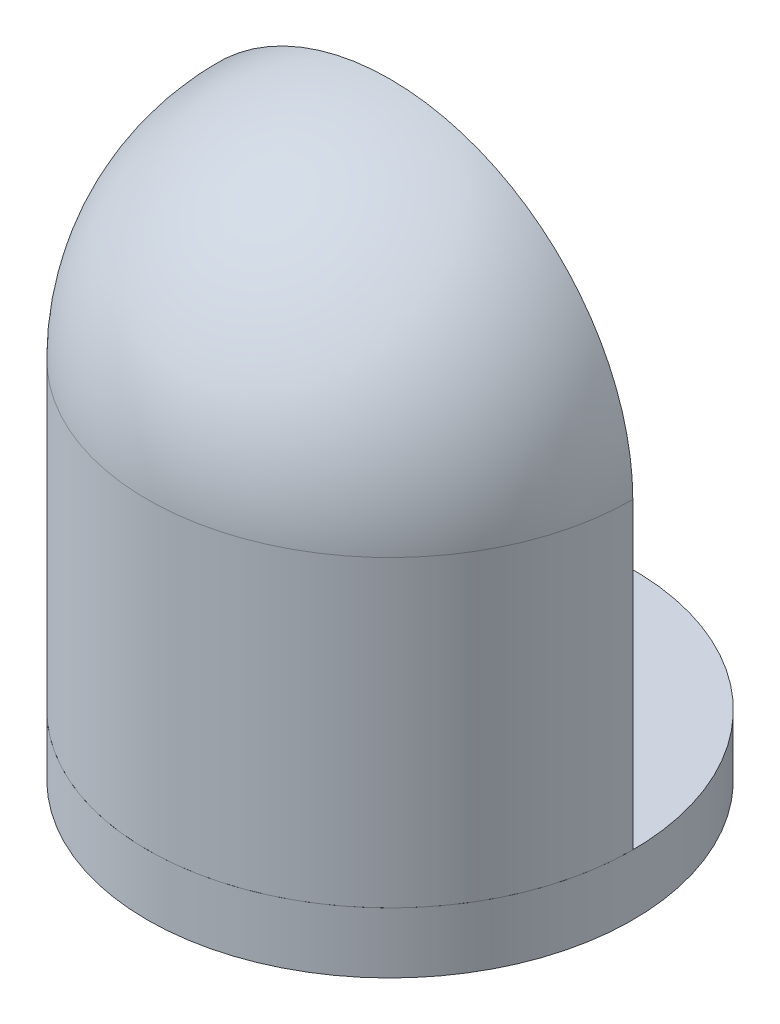
ISO-10303-21;
HEADER;
FILE_DESCRIPTION(('STEP AP214'),'2;1');
FILE_NAME('part.step','',(''),(''),'','','');
FILE_SCHEMA(('AUTOMOTIVE_DESIGN { 1 0 10303 214 1 1 1 1 }'));
ENDSEC;
DATA;
#1=APPLICATION_CONTEXT('core data for automotive mechanical design processes');
#2=APPLICATION_PROTOCOL_DEFINITION('international standard','automotive_design',2000,#1);
#3=PRODUCT_CONTEXT('',#1,'mechanical');
#4=PRODUCT('Part','Part','',(#3));
#5=PRODUCT_RELATED_PRODUCT_CATEGORY('part','',(#4));
#6=PRODUCT_DEFINITION_FORMATION('','',#4);
#7=PRODUCT_DEFINITION_CONTEXT('part definition',#1,'design');
#8=PRODUCT_DEFINITION('design','',#6,#7);
#9=PRODUCT_DEFINITION_SHAPE('','',#8);
#10=(LENGTH_UNIT() NAMED_UNIT(*) SI_UNIT(.MILLI.,.METRE.));
#11=(NAMED_UNIT(*) PLANE_ANGLE_UNIT() SI_UNIT($,.RADIAN.));
#12=(NAMED_UNIT(*) SI_UNIT($,.STERADIAN.) SOLID_ANGLE_UNIT());
#13=UNCERTAINTY_MEASURE_WITH_UNIT(LENGTH_MEASURE(1.E-05),#10,'distance_accuracy_value','');
#14=(GEOMETRIC_REPRESENTATION_CONTEXT(3) GLOBAL_UNCERTAINTY_ASSIGNED_CONTEXT((#13)) GLOBAL_UNIT_ASSIGNED_CONTEXT((#10,
#11,#12)) REPRESENTATION_CONTEXT('',''));
#15=CARTESIAN_POINT('',(0.,0.,0.));
#16=DIRECTION('',(0.,0.,1.));
#17=DIRECTION('',(1.,0.,0.));
#18=AXIS2_PLACEMENT_3D('',#15,#16,#17);
#19=CARTESIAN_POINT('',(0.,60.,0.));
#20=DIRECTION('',(0.,1.,0.));
#21=DIRECTION('',(-1.,0.,0.));
#22=AXIS2_PLACEMENT_3D('',#19,#20,#21);
#23=SPHERICAL_SURFACE('',#22,40.);
#24=CARTESIAN_POINT('',(0.,60.,0.));
#25=DIRECTION('',(0.,1.,0.));
#26=DIRECTION('',(0.,0.,1.));
#27=AXIS2_PLACEMENT_3D('',#24,#25,#26);
#28=CIRCLE('',#27,40.);
#29=CARTESIAN_POINT('',(-40.,60.,-2.79318507107451E-13));
#30=VERTEX_POINT('',#29);
#31=CARTESIAN_POINT('',(40.,60.,0.));
#32=VERTEX_POINT('',#31);
#33=EDGE_CURVE('E55',#30,#32,#28,.T.);
#34=ORIENTED_EDGE('',*,*,#33,.T.);
#35=CARTESIAN_POINT('',(0.,60.,0.));
#36=DIRECTION('',(0.,0.,-1.));
#37=DIRECTION('',(-1.,0.,0.));
#38=AXIS2_PLACEMENT_3D('',#35,#36,#37);
#39=CIRCLE('',#38,40.);
#40=EDGE_CURVE('E77',#30,#32,#39,.T.);
#41=ORIENTED_EDGE('',*,*,#40,.F.);
#42=EDGE_LOOP('',(#34,#41));
#43=FACE_BOUND('',#42,.T.);
#44=ADVANCED_FACE('F47',(#43),#23,.T.);
#45=CARTESIAN_POINT('',(0.,10.,0.));
#46=DIRECTION('',(0.,1.,0.));
#47=DIRECTION('',(0.,0.,1.));
#48=AXIS2_PLACEMENT_3D('',#45,#46,#47);
#49=PLANE('',#48);
#50=CARTESIAN_POINT('',(0.,9.99999999999999,0.));
#51=DIRECTION('',(0.,1.,0.));
#52=DIRECTION('',(0.,0.,1.));
#53=AXIS2_PLACEMENT_3D('',#50,#51,#52);
#54=CIRCLE('',#53,40.);
#55=CARTESIAN_POINT('',(-40.,10.,-2.79318507107451E-13));
#56=VERTEX_POINT('',#55);
#57=CARTESIAN_POINT('',(40.,10.,0.));
#58=VERTEX_POINT('',#57);
#59=EDGE_CURVE('E12',#56,#58,#54,.T.);
#60=ORIENTED_EDGE('',*,*,#59,.F.);
#61=DIRECTION('',(-1.,0.,0.));
#62=VECTOR('',#61,1.);
#63=CARTESIAN_POINT('',(0.,10.,0.));
#64=LINE('',#63,#62);
#65=EDGE_CURVE('E72',#58,#56,#64,.T.);
#66=ORIENTED_EDGE('',*,*,#65,.F.);
#67=EDGE_LOOP('',(#60,#66));
#68=FACE_BOUND('',#67,.T.);
#69=ADVANCED_FACE('F49',(#68),#49,.F.);
#70=CARTESIAN_POINT('',(0.,111.976558556198,0.));
#71=DIRECTION('',(0.,1.,0.));
#72=DIRECTION('',(0.,0.,1.));
#73=AXIS2_PLACEMENT_3D('',#70,#71,#72);
#74=CYLINDRICAL_SURFACE('',#73,40.);
#75=DIRECTION('',(0.,1.,0.));
#76=VECTOR('',#75,1.);
#77=CARTESIAN_POINT('',(-40.,0.,-2.79318507107451E-13));
#78=LINE('',#77,#76);
#79=EDGE_CURVE('E76',#56,#30,#78,.T.);
#80=ORIENTED_EDGE('',*,*,#79,.F.);
#81=ORIENTED_EDGE('',*,*,#59,.T.);
#82=DIRECTION('',(0.,1.,0.));
#83=VECTOR('',#82,1.);
#84=CARTESIAN_POINT('',(40.,0.,0.));
#85=LINE('',#84,#83);
#86=EDGE_CURVE('E80',#58,#32,#85,.T.);
#87=ORIENTED_EDGE('',*,*,#86,.T.);
#88=ORIENTED_EDGE('',*,*,#33,.F.);
#89=EDGE_LOOP('',(#80,#81,#87,#88));
#90=FACE_BOUND('',#89,.T.);
#91=ADVANCED_FACE('F79',(#90),#74,.T.);
#92=CARTESIAN_POINT('',(0.,0.,0.));
#93=DIRECTION('',(0.,0.,-1.));
#94=DIRECTION('',(-1.,0.,0.));
#95=AXIS2_PLACEMENT_3D('',#92,#93,#94);
#96=PLANE('',#95);
#97=ORIENTED_EDGE('',*,*,#40,.T.);
#98=ORIENTED_EDGE('',*,*,#86,.F.);
#99=ORIENTED_EDGE('',*,*,#65,.T.);
#100=ORIENTED_EDGE('',*,*,#79,.T.);
#101=EDGE_LOOP('',(#97,#98,#99,#100));
#102=FACE_BOUND('',#101,.T.);
#103=ADVANCED_FACE('F81',(#102),#96,.T.);
#104=CLOSED_SHELL('',(#44,#69,#91,#103));
#105=MANIFOLD_SOLID_BREP('B2',#104);
#106=CARTESIAN_POINT('',(0.,10.,0.));
#107=DIRECTION('',(0.,-1.,0.));
#108=DIRECTION('',(0.,0.,-1.));
#109=AXIS2_PLACEMENT_3D('',#106,#107,#108);
#110=CYLINDRICAL_SURFACE('',#109,40.);
#111=CARTESIAN_POINT('',(0.,10.,0.));
#112=DIRECTION('',(0.,1.,0.));
#113=DIRECTION('',(0.,0.,1.));
#114=AXIS2_PLACEMENT_3D('',#111,#112,#113);
#115=CIRCLE('',#114,40.);
#116=CARTESIAN_POINT('',(0.,10.,40.));
#117=VERTEX_POINT('',#116);
#118=EDGE_CURVE('E46',#117,#117,#115,.T.);
#119=ORIENTED_EDGE('',*,*,#118,.F.);
#120=EDGE_LOOP('',(#119));
#121=FACE_BOUND('',#120,.T.);
#122=CARTESIAN_POINT('',(0.,0.,0.));
#123=DIRECTION('',(0.,1.,0.));
#124=DIRECTION('',(0.,0.,1.));
#125=AXIS2_PLACEMENT_3D('',#122,#123,#124);
#126=CIRCLE('',#125,40.);
#127=CARTESIAN_POINT('',(0.,0.,40.));
#128=VERTEX_POINT('',#127);
#129=EDGE_CURVE('E131',#128,#128,#126,.T.);
#130=ORIENTED_EDGE('',*,*,#129,.T.);
#131=EDGE_LOOP('',(#130));
#132=FACE_BOUND('',#131,.T.);
#133=ADVANCED_FACE('F128',(#121,#132),#110,.T.);
#134=CARTESIAN_POINT('',(0.,10.,0.));
#135=DIRECTION('',(0.,1.,0.));
#136=DIRECTION('',(0.,0.,1.));
#137=AXIS2_PLACEMENT_3D('',#134,#135,#136);
#138=PLANE('',#137);
#139=ORIENTED_EDGE('',*,*,#118,.T.);
#140=EDGE_LOOP('',(#139));
#141=FACE_BOUND('',#140,.T.);
#142=ADVANCED_FACE('F143',(#141),#138,.T.);
#143=CARTESIAN_POINT('',(0.,0.,0.));
#144=DIRECTION('',(0.,1.,0.));
#145=DIRECTION('',(0.,0.,1.));
#146=AXIS2_PLACEMENT_3D('',#143,#144,#145);
#147=PLANE('',#146);
#148=ORIENTED_EDGE('',*,*,#129,.F.);
#149=EDGE_LOOP('',(#148));
#150=FACE_BOUND('',#149,.T.);
#151=ADVANCED_FACE('F141',(#150),#147,.F.);
#152=CLOSED_SHELL('',(#133,#142,#151));
#153=MANIFOLD_SOLID_BREP('B6',#152);
#154=ADVANCED_BREP_SHAPE_REPRESENTATION('',(#18,#105,#153),#14);
#155=SHAPE_DEFINITION_REPRESENTATION(#9,#154);
ENDSEC;
END-ISO-10303-21;
